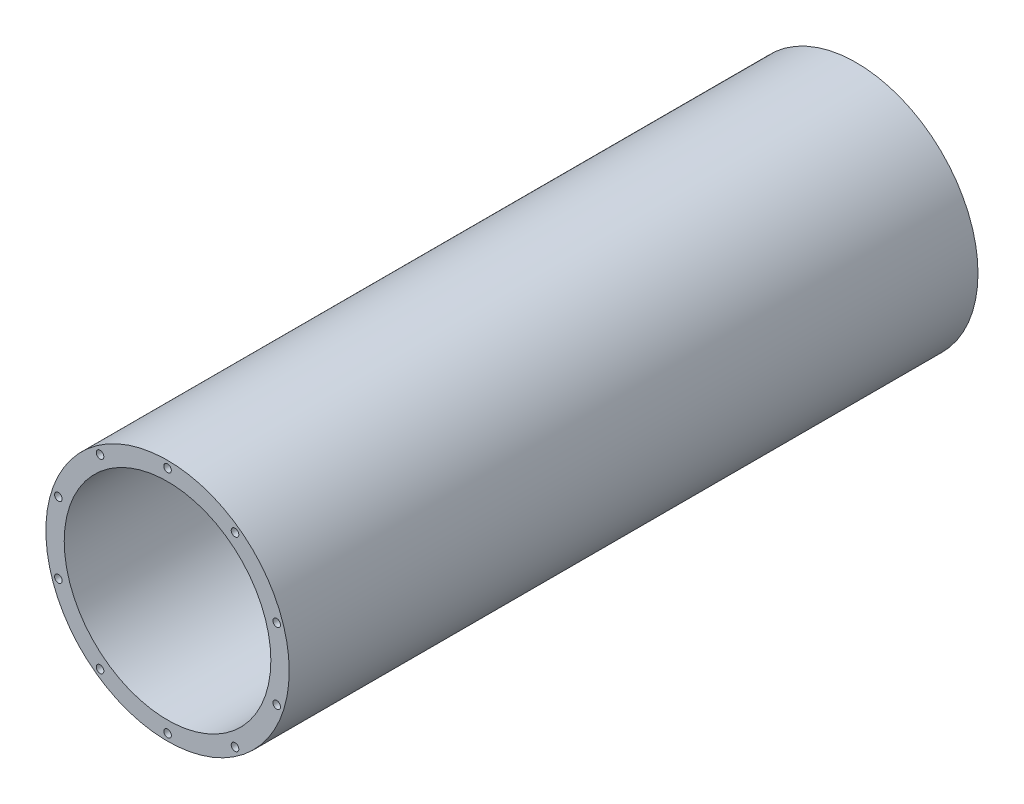
ISO-10303-21;
HEADER;
FILE_DESCRIPTION(('STEP AP214'),'2;1');
FILE_NAME('part.step','',(''),(''),'','','');
FILE_SCHEMA(('AUTOMOTIVE_DESIGN { 1 0 10303 214 1 1 1 1 }'));
ENDSEC;
DATA;
#1=APPLICATION_CONTEXT('core data for automotive mechanical design processes');
#2=APPLICATION_PROTOCOL_DEFINITION('international standard','automotive_design',2000,#1);
#3=PRODUCT_CONTEXT('',#1,'mechanical');
#4=PRODUCT('Part','Part','',(#3));
#5=PRODUCT_RELATED_PRODUCT_CATEGORY('part','',(#4));
#6=PRODUCT_DEFINITION_FORMATION('','',#4);
#7=PRODUCT_DEFINITION_CONTEXT('part definition',#1,'design');
#8=PRODUCT_DEFINITION('design','',#6,#7);
#9=PRODUCT_DEFINITION_SHAPE('','',#8);
#10=(LENGTH_UNIT() NAMED_UNIT(*) SI_UNIT(.MILLI.,.METRE.));
#11=(NAMED_UNIT(*) PLANE_ANGLE_UNIT() SI_UNIT($,.RADIAN.));
#12=(NAMED_UNIT(*) SI_UNIT($,.STERADIAN.) SOLID_ANGLE_UNIT());
#13=UNCERTAINTY_MEASURE_WITH_UNIT(LENGTH_MEASURE(1.E-05),#10,'distance_accuracy_value','');
#14=(GEOMETRIC_REPRESENTATION_CONTEXT(3) GLOBAL_UNCERTAINTY_ASSIGNED_CONTEXT((#13)) GLOBAL_UNIT_ASSIGNED_CONTEXT((#10,
#11,#12)) REPRESENTATION_CONTEXT('',''));
#15=CARTESIAN_POINT('',(0.,0.,0.));
#16=DIRECTION('',(0.,0.,1.));
#17=DIRECTION('',(1.,0.,0.));
#18=AXIS2_PLACEMENT_3D('',#15,#16,#17);
#19=CARTESIAN_POINT('',(0.,0.,300.));
#20=DIRECTION('',(0.,0.,-1.));
#21=DIRECTION('',(-1.,0.,0.));
#22=AXIS2_PLACEMENT_3D('',#19,#20,#21);
#23=CYLINDRICAL_SURFACE('',#22,53.);
#24=CARTESIAN_POINT('',(0.,0.,300.));
#25=DIRECTION('',(0.,0.,1.));
#26=DIRECTION('',(1.,0.,0.));
#27=AXIS2_PLACEMENT_3D('',#24,#25,#26);
#28=CIRCLE('',#27,53.);
#29=CARTESIAN_POINT('',(53.,0.,300.));
#30=VERTEX_POINT('',#29);
#31=EDGE_CURVE('E11',#30,#30,#28,.T.);
#32=ORIENTED_EDGE('',*,*,#31,.F.);
#33=EDGE_LOOP('',(#32));
#34=FACE_BOUND('',#33,.T.);
#35=CARTESIAN_POINT('',(0.,0.,0.));
#36=DIRECTION('',(0.,0.,1.));
#37=DIRECTION('',(1.,0.,0.));
#38=AXIS2_PLACEMENT_3D('',#35,#36,#37);
#39=CIRCLE('',#38,53.);
#40=CARTESIAN_POINT('',(53.,0.,0.));
#41=VERTEX_POINT('',#40);
#42=EDGE_CURVE('E42',#41,#41,#39,.T.);
#43=ORIENTED_EDGE('',*,*,#42,.T.);
#44=EDGE_LOOP('',(#43));
#45=FACE_BOUND('',#44,.T.);
#46=ADVANCED_FACE('F39',(#34,#45),#23,.T.);
#47=CARTESIAN_POINT('',(0.,0.,300.));
#48=DIRECTION('',(0.,0.,1.));
#49=DIRECTION('',(1.,0.,0.));
#50=AXIS2_PLACEMENT_3D('',#47,#48,#49);
#51=PLANE('',#50);
#52=CARTESIAN_POINT('',(-29.3892626146231,40.4508497187478,300.));
#53=DIRECTION('',(0.,0.,1.));
#54=DIRECTION('',(1.,0.,0.));
#55=AXIS2_PLACEMENT_3D('',#52,#53,#54);
#56=CIRCLE('',#55,1.64999999999999);
#57=CARTESIAN_POINT('',(-27.7392626146231,40.4508497187478,300.));
#58=VERTEX_POINT('',#57);
#59=EDGE_CURVE('E118',#58,#58,#56,.T.);
#60=ORIENTED_EDGE('',*,*,#59,.F.);
#61=EDGE_LOOP('',(#60));
#62=FACE_BOUND('',#61,.T.);
#63=CARTESIAN_POINT('',(-47.5528258147575,15.4508497187479,300.));
#64=DIRECTION('',(0.,0.,1.));
#65=DIRECTION('',(1.,0.,0.));
#66=AXIS2_PLACEMENT_3D('',#63,#64,#65);
#67=CIRCLE('',#66,1.64999999999999);
#68=CARTESIAN_POINT('',(-45.9028258147575,15.4508497187479,300.));
#69=VERTEX_POINT('',#68);
#70=EDGE_CURVE('E117',#69,#69,#67,.T.);
#71=ORIENTED_EDGE('',*,*,#70,.F.);
#72=EDGE_LOOP('',(#71));
#73=FACE_BOUND('',#72,.T.);
#74=CARTESIAN_POINT('',(-47.5528258147578,-15.4508497187469,300.));
#75=DIRECTION('',(0.,0.,1.));
#76=DIRECTION('',(1.,0.,0.));
#77=AXIS2_PLACEMENT_3D('',#74,#75,#76);
#78=CIRCLE('',#77,1.64999999999999);
#79=CARTESIAN_POINT('',(-45.9028258147578,-15.4508497187469,300.));
#80=VERTEX_POINT('',#79);
#81=EDGE_CURVE('E128',#80,#80,#78,.T.);
#82=ORIENTED_EDGE('',*,*,#81,.F.);
#83=EDGE_LOOP('',(#82));
#84=FACE_BOUND('',#83,.T.);
#85=CARTESIAN_POINT('',(-29.389262614624,-40.4508497187471,300.));
#86=DIRECTION('',(0.,0.,1.));
#87=DIRECTION('',(1.,0.,0.));
#88=AXIS2_PLACEMENT_3D('',#85,#86,#87);
#89=CIRCLE('',#88,1.64999999999999);
#90=CARTESIAN_POINT('',(-27.739262614624,-40.4508497187471,300.));
#91=VERTEX_POINT('',#90);
#92=EDGE_CURVE('E134',#91,#91,#89,.T.);
#93=ORIENTED_EDGE('',*,*,#92,.F.);
#94=EDGE_LOOP('',(#93));
#95=FACE_BOUND('',#94,.T.);
#96=CARTESIAN_POINT('',(0.,-50.,300.));
#97=DIRECTION('',(0.,0.,1.));
#98=DIRECTION('',(1.,0.,0.));
#99=AXIS2_PLACEMENT_3D('',#96,#97,#98);
#100=CIRCLE('',#99,1.64999999999999);
#101=CARTESIAN_POINT('',(1.64999999999999,-50.,300.));
#102=VERTEX_POINT('',#101);
#103=EDGE_CURVE('E140',#102,#102,#100,.T.);
#104=ORIENTED_EDGE('',*,*,#103,.F.);
#105=EDGE_LOOP('',(#104));
#106=FACE_BOUND('',#105,.T.);
#107=CARTESIAN_POINT('',(29.3892626146234,-40.4508497187475,300.));
#108=DIRECTION('',(0.,0.,1.));
#109=DIRECTION('',(1.,0.,0.));
#110=AXIS2_PLACEMENT_3D('',#107,#108,#109);
#111=CIRCLE('',#110,1.64999999999999);
#112=CARTESIAN_POINT('',(31.0392626146234,-40.4508497187475,300.));
#113=VERTEX_POINT('',#112);
#114=EDGE_CURVE('E146',#113,#113,#111,.T.);
#115=ORIENTED_EDGE('',*,*,#114,.F.);
#116=EDGE_LOOP('',(#115));
#117=FACE_BOUND('',#116,.T.);
#118=CARTESIAN_POINT('',(47.5528258147576,-15.4508497187476,300.));
#119=DIRECTION('',(0.,0.,1.));
#120=DIRECTION('',(1.,0.,0.));
#121=AXIS2_PLACEMENT_3D('',#118,#119,#120);
#122=CIRCLE('',#121,1.64999999999999);
#123=CARTESIAN_POINT('',(49.2028258147576,-15.4508497187476,300.));
#124=VERTEX_POINT('',#123);
#125=EDGE_CURVE('E152',#124,#124,#122,.T.);
#126=ORIENTED_EDGE('',*,*,#125,.F.);
#127=EDGE_LOOP('',(#126));
#128=FACE_BOUND('',#127,.T.);
#129=CARTESIAN_POINT('',(47.5528258147577,15.4508497187472,300.));
#130=DIRECTION('',(0.,0.,1.));
#131=DIRECTION('',(1.,0.,0.));
#132=AXIS2_PLACEMENT_3D('',#129,#130,#131);
#133=CIRCLE('',#132,1.64999999999999);
#134=CARTESIAN_POINT('',(49.2028258147577,15.4508497187472,300.));
#135=VERTEX_POINT('',#134);
#136=EDGE_CURVE('E158',#135,#135,#133,.T.);
#137=ORIENTED_EDGE('',*,*,#136,.F.);
#138=EDGE_LOOP('',(#137));
#139=FACE_BOUND('',#138,.T.);
#140=CARTESIAN_POINT('',(29.3892626146237,40.4508497187473,300.));
#141=DIRECTION('',(0.,0.,1.));
#142=DIRECTION('',(1.,0.,0.));
#143=AXIS2_PLACEMENT_3D('',#140,#141,#142);
#144=CIRCLE('',#143,1.64999999999999);
#145=CARTESIAN_POINT('',(31.0392626146237,40.4508497187473,300.));
#146=VERTEX_POINT('',#145);
#147=EDGE_CURVE('E164',#146,#146,#144,.T.);
#148=ORIENTED_EDGE('',*,*,#147,.F.);
#149=EDGE_LOOP('',(#148));
#150=FACE_BOUND('',#149,.T.);
#151=CARTESIAN_POINT('',(0.,50.,300.));
#152=DIRECTION('',(0.,0.,1.));
#153=DIRECTION('',(1.,0.,0.));
#154=AXIS2_PLACEMENT_3D('',#151,#152,#153);
#155=CIRCLE('',#154,1.64999999999999);
#156=CARTESIAN_POINT('',(1.64999999999999,50.,300.));
#157=VERTEX_POINT('',#156);
#158=EDGE_CURVE('E170',#157,#157,#155,.T.);
#159=ORIENTED_EDGE('',*,*,#158,.F.);
#160=EDGE_LOOP('',(#159));
#161=FACE_BOUND('',#160,.T.);
#162=CARTESIAN_POINT('',(0.,0.,300.));
#163=DIRECTION('',(0.,0.,-1.));
#164=DIRECTION('',(-1.,0.,0.));
#165=AXIS2_PLACEMENT_3D('',#162,#163,#164);
#166=CIRCLE('',#165,45.);
#167=CARTESIAN_POINT('',(-45.,0.,300.));
#168=VERTEX_POINT('',#167);
#169=EDGE_CURVE('E237',#168,#168,#166,.T.);
#170=ORIENTED_EDGE('',*,*,#169,.T.);
#171=EDGE_LOOP('',(#170));
#172=FACE_BOUND('',#171,.T.);
#173=ORIENTED_EDGE('',*,*,#31,.T.);
#174=EDGE_LOOP('',(#173));
#175=FACE_BOUND('',#174,.T.);
#176=ADVANCED_FACE('F248',(#62,#73,#84,#95,#106,#117,#128,#139,#150,#161,#172,#175),#51,.T.);
#177=CARTESIAN_POINT('',(0.,0.,0.));
#178=DIRECTION('',(0.,0.,1.));
#179=DIRECTION('',(1.,0.,0.));
#180=AXIS2_PLACEMENT_3D('',#177,#178,#179);
#181=PLANE('',#180);
#182=CARTESIAN_POINT('',(-29.3892626146231,40.4508497187478,0.));
#183=DIRECTION('',(0.,0.,-1.));
#184=DIRECTION('',(-1.,0.,0.));
#185=AXIS2_PLACEMENT_3D('',#182,#183,#184);
#186=CIRCLE('',#185,1.64999999999999);
#187=CARTESIAN_POINT('',(-31.0392626146231,40.4508497187478,0.));
#188=VERTEX_POINT('',#187);
#189=EDGE_CURVE('E176',#188,#188,#186,.T.);
#190=ORIENTED_EDGE('',*,*,#189,.F.);
#191=EDGE_LOOP('',(#190));
#192=FACE_BOUND('',#191,.T.);
#193=CARTESIAN_POINT('',(-47.5528258147575,15.4508497187479,0.));
#194=DIRECTION('',(0.,0.,-1.));
#195=DIRECTION('',(-1.,0.,0.));
#196=AXIS2_PLACEMENT_3D('',#193,#194,#195);
#197=CIRCLE('',#196,1.64999999999999);
#198=CARTESIAN_POINT('',(-49.2028258147575,15.4508497187479,0.));
#199=VERTEX_POINT('',#198);
#200=EDGE_CURVE('E182',#199,#199,#197,.T.);
#201=ORIENTED_EDGE('',*,*,#200,.F.);
#202=EDGE_LOOP('',(#201));
#203=FACE_BOUND('',#202,.T.);
#204=CARTESIAN_POINT('',(-47.5528258147578,-15.4508497187469,0.));
#205=DIRECTION('',(0.,0.,-1.));
#206=DIRECTION('',(-1.,0.,0.));
#207=AXIS2_PLACEMENT_3D('',#204,#205,#206);
#208=CIRCLE('',#207,1.64999999999999);
#209=CARTESIAN_POINT('',(-49.2028258147578,-15.4508497187469,0.));
#210=VERTEX_POINT('',#209);
#211=EDGE_CURVE('E188',#210,#210,#208,.T.);
#212=ORIENTED_EDGE('',*,*,#211,.F.);
#213=EDGE_LOOP('',(#212));
#214=FACE_BOUND('',#213,.T.);
#215=CARTESIAN_POINT('',(-29.389262614624,-40.4508497187471,0.));
#216=DIRECTION('',(0.,0.,-1.));
#217=DIRECTION('',(-1.,0.,0.));
#218=AXIS2_PLACEMENT_3D('',#215,#216,#217);
#219=CIRCLE('',#218,1.64999999999999);
#220=CARTESIAN_POINT('',(-31.039262614624,-40.4508497187471,0.));
#221=VERTEX_POINT('',#220);
#222=EDGE_CURVE('E194',#221,#221,#219,.T.);
#223=ORIENTED_EDGE('',*,*,#222,.F.);
#224=EDGE_LOOP('',(#223));
#225=FACE_BOUND('',#224,.T.);
#226=CARTESIAN_POINT('',(0.,-50.,0.));
#227=DIRECTION('',(0.,0.,-1.));
#228=DIRECTION('',(-1.,0.,0.));
#229=AXIS2_PLACEMENT_3D('',#226,#227,#228);
#230=CIRCLE('',#229,1.64999999999999);
#231=CARTESIAN_POINT('',(-1.64999999999999,-50.,0.));
#232=VERTEX_POINT('',#231);
#233=EDGE_CURVE('E200',#232,#232,#230,.T.);
#234=ORIENTED_EDGE('',*,*,#233,.F.);
#235=EDGE_LOOP('',(#234));
#236=FACE_BOUND('',#235,.T.);
#237=CARTESIAN_POINT('',(29.3892626146234,-40.4508497187475,0.));
#238=DIRECTION('',(0.,0.,-1.));
#239=DIRECTION('',(-1.,0.,0.));
#240=AXIS2_PLACEMENT_3D('',#237,#238,#239);
#241=CIRCLE('',#240,1.64999999999999);
#242=CARTESIAN_POINT('',(27.7392626146234,-40.4508497187475,0.));
#243=VERTEX_POINT('',#242);
#244=EDGE_CURVE('E206',#243,#243,#241,.T.);
#245=ORIENTED_EDGE('',*,*,#244,.F.);
#246=EDGE_LOOP('',(#245));
#247=FACE_BOUND('',#246,.T.);
#248=CARTESIAN_POINT('',(47.5528258147576,-15.4508497187476,0.));
#249=DIRECTION('',(0.,0.,-1.));
#250=DIRECTION('',(-1.,0.,0.));
#251=AXIS2_PLACEMENT_3D('',#248,#249,#250);
#252=CIRCLE('',#251,1.64999999999999);
#253=CARTESIAN_POINT('',(45.9028258147576,-15.4508497187476,0.));
#254=VERTEX_POINT('',#253);
#255=EDGE_CURVE('E212',#254,#254,#252,.T.);
#256=ORIENTED_EDGE('',*,*,#255,.F.);
#257=EDGE_LOOP('',(#256));
#258=FACE_BOUND('',#257,.T.);
#259=CARTESIAN_POINT('',(47.5528258147577,15.4508497187472,0.));
#260=DIRECTION('',(0.,0.,-1.));
#261=DIRECTION('',(-1.,0.,0.));
#262=AXIS2_PLACEMENT_3D('',#259,#260,#261);
#263=CIRCLE('',#262,1.64999999999999);
#264=CARTESIAN_POINT('',(45.9028258147577,15.4508497187472,0.));
#265=VERTEX_POINT('',#264);
#266=EDGE_CURVE('E218',#265,#265,#263,.T.);
#267=ORIENTED_EDGE('',*,*,#266,.F.);
#268=EDGE_LOOP('',(#267));
#269=FACE_BOUND('',#268,.T.);
#270=CARTESIAN_POINT('',(29.3892626146237,40.4508497187473,0.));
#271=DIRECTION('',(0.,0.,-1.));
#272=DIRECTION('',(-1.,0.,0.));
#273=AXIS2_PLACEMENT_3D('',#270,#271,#272);
#274=CIRCLE('',#273,1.64999999999999);
#275=CARTESIAN_POINT('',(27.7392626146237,40.4508497187473,0.));
#276=VERTEX_POINT('',#275);
#277=EDGE_CURVE('E224',#276,#276,#274,.T.);
#278=ORIENTED_EDGE('',*,*,#277,.F.);
#279=EDGE_LOOP('',(#278));
#280=FACE_BOUND('',#279,.T.);
#281=CARTESIAN_POINT('',(0.,50.,0.));
#282=DIRECTION('',(0.,0.,-1.));
#283=DIRECTION('',(-1.,0.,0.));
#284=AXIS2_PLACEMENT_3D('',#281,#282,#283);
#285=CIRCLE('',#284,1.64999999999999);
#286=CARTESIAN_POINT('',(-1.64999999999999,50.,0.));
#287=VERTEX_POINT('',#286);
#288=EDGE_CURVE('E230',#287,#287,#285,.T.);
#289=ORIENTED_EDGE('',*,*,#288,.F.);
#290=EDGE_LOOP('',(#289));
#291=FACE_BOUND('',#290,.T.);
#292=CARTESIAN_POINT('',(0.,0.,0.));
#293=DIRECTION('',(0.,0.,-1.));
#294=DIRECTION('',(-1.,0.,0.));
#295=AXIS2_PLACEMENT_3D('',#292,#293,#294);
#296=CIRCLE('',#295,45.);
#297=CARTESIAN_POINT('',(-45.,0.,0.));
#298=VERTEX_POINT('',#297);
#299=EDGE_CURVE('E236',#298,#298,#296,.T.);
#300=ORIENTED_EDGE('',*,*,#299,.F.);
#301=EDGE_LOOP('',(#300));
#302=FACE_BOUND('',#301,.T.);
#303=ORIENTED_EDGE('',*,*,#42,.F.);
#304=EDGE_LOOP('',(#303));
#305=FACE_BOUND('',#304,.T.);
#306=ADVANCED_FACE('F245',(#192,#203,#214,#225,#236,#247,#258,#269,#280,#291,#302,#305),#181,.F.);
#307=CARTESIAN_POINT('',(0.,0.,300.));
#308=DIRECTION('',(0.,0.,-1.));
#309=DIRECTION('',(-1.,0.,0.));
#310=AXIS2_PLACEMENT_3D('',#307,#308,#309);
#311=CYLINDRICAL_SURFACE('',#310,45.);
#312=ORIENTED_EDGE('',*,*,#169,.F.);
#313=EDGE_LOOP('',(#312));
#314=FACE_BOUND('',#313,.T.);
#315=ORIENTED_EDGE('',*,*,#299,.T.);
#316=EDGE_LOOP('',(#315));
#317=FACE_BOUND('',#316,.T.);
#318=ADVANCED_FACE('F243',(#314,#317),#311,.F.);
#319=CARTESIAN_POINT('',(0.,50.,10.1));
#320=DIRECTION('',(0.,0.,-1.));
#321=DIRECTION('',(-1.,0.,0.));
#322=AXIS2_PLACEMENT_3D('',#319,#320,#321);
#323=CONICAL_SURFACE('',#322,1.64999999999999,1.02974425867665);
#324=CARTESIAN_POINT('',(0.,50.,11.0914200213955));
#325=VERTEX_POINT('',#324);
#326=VERTEX_LOOP('',#325);
#327=FACE_BOUND('',#326,.T.);
#328=CARTESIAN_POINT('',(0.,50.,10.1));
#329=DIRECTION('',(0.,0.,-1.));
#330=DIRECTION('',(-1.,0.,0.));
#331=AXIS2_PLACEMENT_3D('',#328,#329,#330);
#332=CIRCLE('',#331,1.64999999999999);
#333=CARTESIAN_POINT('',(-1.64999999999999,50.,10.1));
#334=VERTEX_POINT('',#333);
#335=EDGE_CURVE('E233',#334,#334,#332,.T.);
#336=ORIENTED_EDGE('',*,*,#335,.T.);
#337=EDGE_LOOP('',(#336));
#338=FACE_BOUND('',#337,.T.);
#339=ADVANCED_FACE('F269',(#327,#338),#323,.F.);
#340=CARTESIAN_POINT('',(0.,50.,0.));
#341=DIRECTION('',(0.,0.,-1.));
#342=DIRECTION('',(-1.,0.,0.));
#343=AXIS2_PLACEMENT_3D('',#340,#341,#342);
#344=CYLINDRICAL_SURFACE('',#343,1.64999999999999);
#345=ORIENTED_EDGE('',*,*,#335,.F.);
#346=EDGE_LOOP('',(#345));
#347=FACE_BOUND('',#346,.T.);
#348=ORIENTED_EDGE('',*,*,#288,.T.);
#349=EDGE_LOOP('',(#348));
#350=FACE_BOUND('',#349,.T.);
#351=ADVANCED_FACE('F273',(#347,#350),#344,.F.);
#352=CARTESIAN_POINT('',(29.3892626146237,40.4508497187473,10.1));
#353=DIRECTION('',(0.,0.,-1.));
#354=DIRECTION('',(-1.,0.,0.));
#355=AXIS2_PLACEMENT_3D('',#352,#353,#354);
#356=CONICAL_SURFACE('',#355,1.64999999999999,1.02974425867665);
#357=CARTESIAN_POINT('',(29.3892626146237,40.4508497187473,11.0914200213955));
#358=VERTEX_POINT('',#357);
#359=VERTEX_LOOP('',#358);
#360=FACE_BOUND('',#359,.T.);
#361=CARTESIAN_POINT('',(29.3892626146237,40.4508497187473,10.1));
#362=DIRECTION('',(0.,0.,-1.));
#363=DIRECTION('',(-1.,0.,0.));
#364=AXIS2_PLACEMENT_3D('',#361,#362,#363);
#365=CIRCLE('',#364,1.64999999999999);
#366=CARTESIAN_POINT('',(27.7392626146237,40.4508497187473,10.1));
#367=VERTEX_POINT('',#366);
#368=EDGE_CURVE('E227',#367,#367,#365,.T.);
#369=ORIENTED_EDGE('',*,*,#368,.T.);
#370=EDGE_LOOP('',(#369));
#371=FACE_BOUND('',#370,.T.);
#372=ADVANCED_FACE('F276',(#360,#371),#356,.F.);
#373=CARTESIAN_POINT('',(29.3892626146237,40.4508497187473,0.));
#374=DIRECTION('',(0.,0.,-1.));
#375=DIRECTION('',(-1.,0.,0.));
#376=AXIS2_PLACEMENT_3D('',#373,#374,#375);
#377=CYLINDRICAL_SURFACE('',#376,1.64999999999999);
#378=ORIENTED_EDGE('',*,*,#368,.F.);
#379=EDGE_LOOP('',(#378));
#380=FACE_BOUND('',#379,.T.);
#381=ORIENTED_EDGE('',*,*,#277,.T.);
#382=EDGE_LOOP('',(#381));
#383=FACE_BOUND('',#382,.T.);
#384=ADVANCED_FACE('F280',(#380,#383),#377,.F.);
#385=CARTESIAN_POINT('',(47.5528258147577,15.4508497187472,10.1));
#386=DIRECTION('',(0.,0.,-1.));
#387=DIRECTION('',(-1.,0.,0.));
#388=AXIS2_PLACEMENT_3D('',#385,#386,#387);
#389=CONICAL_SURFACE('',#388,1.64999999999999,1.02974425867665);
#390=CARTESIAN_POINT('',(47.5528258147577,15.4508497187472,11.0914200213955));
#391=VERTEX_POINT('',#390);
#392=VERTEX_LOOP('',#391);
#393=FACE_BOUND('',#392,.T.);
#394=CARTESIAN_POINT('',(47.5528258147577,15.4508497187472,10.1));
#395=DIRECTION('',(0.,0.,-1.));
#396=DIRECTION('',(-1.,0.,0.));
#397=AXIS2_PLACEMENT_3D('',#394,#395,#396);
#398=CIRCLE('',#397,1.64999999999999);
#399=CARTESIAN_POINT('',(45.9028258147577,15.4508497187472,10.1));
#400=VERTEX_POINT('',#399);
#401=EDGE_CURVE('E221',#400,#400,#398,.T.);
#402=ORIENTED_EDGE('',*,*,#401,.T.);
#403=EDGE_LOOP('',(#402));
#404=FACE_BOUND('',#403,.T.);
#405=ADVANCED_FACE('F283',(#393,#404),#389,.F.);
#406=CARTESIAN_POINT('',(47.5528258147577,15.4508497187472,0.));
#407=DIRECTION('',(0.,0.,-1.));
#408=DIRECTION('',(-1.,0.,0.));
#409=AXIS2_PLACEMENT_3D('',#406,#407,#408);
#410=CYLINDRICAL_SURFACE('',#409,1.64999999999999);
#411=ORIENTED_EDGE('',*,*,#401,.F.);
#412=EDGE_LOOP('',(#411));
#413=FACE_BOUND('',#412,.T.);
#414=ORIENTED_EDGE('',*,*,#266,.T.);
#415=EDGE_LOOP('',(#414));
#416=FACE_BOUND('',#415,.T.);
#417=ADVANCED_FACE('F287',(#413,#416),#410,.F.);
#418=CARTESIAN_POINT('',(47.5528258147576,-15.4508497187476,10.1));
#419=DIRECTION('',(0.,0.,-1.));
#420=DIRECTION('',(-1.,0.,0.));
#421=AXIS2_PLACEMENT_3D('',#418,#419,#420);
#422=CONICAL_SURFACE('',#421,1.64999999999999,1.02974425867665);
#423=CARTESIAN_POINT('',(47.5528258147576,-15.4508497187476,11.0914200213955));
#424=VERTEX_POINT('',#423);
#425=VERTEX_LOOP('',#424);
#426=FACE_BOUND('',#425,.T.);
#427=CARTESIAN_POINT('',(47.5528258147576,-15.4508497187476,10.1));
#428=DIRECTION('',(0.,0.,-1.));
#429=DIRECTION('',(-1.,0.,0.));
#430=AXIS2_PLACEMENT_3D('',#427,#428,#429);
#431=CIRCLE('',#430,1.64999999999999);
#432=CARTESIAN_POINT('',(45.9028258147576,-15.4508497187476,10.1));
#433=VERTEX_POINT('',#432);
#434=EDGE_CURVE('E215',#433,#433,#431,.T.);
#435=ORIENTED_EDGE('',*,*,#434,.T.);
#436=EDGE_LOOP('',(#435));
#437=FACE_BOUND('',#436,.T.);
#438=ADVANCED_FACE('F291',(#426,#437),#422,.F.);
#439=CARTESIAN_POINT('',(47.5528258147576,-15.4508497187476,0.));
#440=DIRECTION('',(0.,0.,-1.));
#441=DIRECTION('',(-1.,0.,0.));
#442=AXIS2_PLACEMENT_3D('',#439,#440,#441);
#443=CYLINDRICAL_SURFACE('',#442,1.64999999999999);
#444=ORIENTED_EDGE('',*,*,#434,.F.);
#445=EDGE_LOOP('',(#444));
#446=FACE_BOUND('',#445,.T.);
#447=ORIENTED_EDGE('',*,*,#255,.T.);
#448=EDGE_LOOP('',(#447));
#449=FACE_BOUND('',#448,.T.);
#450=ADVANCED_FACE('F295',(#446,#449),#443,.F.);
#451=CARTESIAN_POINT('',(29.3892626146234,-40.4508497187475,10.1));
#452=DIRECTION('',(0.,0.,-1.));
#453=DIRECTION('',(-1.,0.,0.));
#454=AXIS2_PLACEMENT_3D('',#451,#452,#453);
#455=CONICAL_SURFACE('',#454,1.64999999999999,1.02974425867665);
#456=CARTESIAN_POINT('',(29.3892626146234,-40.4508497187475,11.0914200213955));
#457=VERTEX_POINT('',#456);
#458=VERTEX_LOOP('',#457);
#459=FACE_BOUND('',#458,.T.);
#460=CARTESIAN_POINT('',(29.3892626146234,-40.4508497187475,10.1));
#461=DIRECTION('',(0.,0.,-1.));
#462=DIRECTION('',(-1.,0.,0.));
#463=AXIS2_PLACEMENT_3D('',#460,#461,#462);
#464=CIRCLE('',#463,1.64999999999999);
#465=CARTESIAN_POINT('',(27.7392626146234,-40.4508497187475,10.1));
#466=VERTEX_POINT('',#465);
#467=EDGE_CURVE('E209',#466,#466,#464,.T.);
#468=ORIENTED_EDGE('',*,*,#467,.T.);
#469=EDGE_LOOP('',(#468));
#470=FACE_BOUND('',#469,.T.);
#471=ADVANCED_FACE('F299',(#459,#470),#455,.F.);
#472=CARTESIAN_POINT('',(29.3892626146234,-40.4508497187475,0.));
#473=DIRECTION('',(0.,0.,-1.));
#474=DIRECTION('',(-1.,0.,0.));
#475=AXIS2_PLACEMENT_3D('',#472,#473,#474);
#476=CYLINDRICAL_SURFACE('',#475,1.64999999999999);
#477=ORIENTED_EDGE('',*,*,#467,.F.);
#478=EDGE_LOOP('',(#477));
#479=FACE_BOUND('',#478,.T.);
#480=ORIENTED_EDGE('',*,*,#244,.T.);
#481=EDGE_LOOP('',(#480));
#482=FACE_BOUND('',#481,.T.);
#483=ADVANCED_FACE('F303',(#479,#482),#476,.F.);
#484=CARTESIAN_POINT('',(0.,-50.,10.1));
#485=DIRECTION('',(0.,0.,-1.));
#486=DIRECTION('',(-1.,0.,0.));
#487=AXIS2_PLACEMENT_3D('',#484,#485,#486);
#488=CONICAL_SURFACE('',#487,1.64999999999999,1.02974425867665);
#489=CARTESIAN_POINT('',(0.,-50.,11.0914200213955));
#490=VERTEX_POINT('',#489);
#491=VERTEX_LOOP('',#490);
#492=FACE_BOUND('',#491,.T.);
#493=CARTESIAN_POINT('',(0.,-50.,10.1));
#494=DIRECTION('',(0.,0.,-1.));
#495=DIRECTION('',(-1.,0.,0.));
#496=AXIS2_PLACEMENT_3D('',#493,#494,#495);
#497=CIRCLE('',#496,1.64999999999999);
#498=CARTESIAN_POINT('',(-1.64999999999999,-50.,10.1));
#499=VERTEX_POINT('',#498);
#500=EDGE_CURVE('E203',#499,#499,#497,.T.);
#501=ORIENTED_EDGE('',*,*,#500,.T.);
#502=EDGE_LOOP('',(#501));
#503=FACE_BOUND('',#502,.T.);
#504=ADVANCED_FACE('F307',(#492,#503),#488,.F.);
#505=CARTESIAN_POINT('',(0.,-50.,0.));
#506=DIRECTION('',(0.,0.,-1.));
#507=DIRECTION('',(-1.,0.,0.));
#508=AXIS2_PLACEMENT_3D('',#505,#506,#507);
#509=CYLINDRICAL_SURFACE('',#508,1.64999999999999);
#510=ORIENTED_EDGE('',*,*,#500,.F.);
#511=EDGE_LOOP('',(#510));
#512=FACE_BOUND('',#511,.T.);
#513=ORIENTED_EDGE('',*,*,#233,.T.);
#514=EDGE_LOOP('',(#513));
#515=FACE_BOUND('',#514,.T.);
#516=ADVANCED_FACE('F311',(#512,#515),#509,.F.);
#517=CARTESIAN_POINT('',(-29.389262614624,-40.4508497187471,10.1));
#518=DIRECTION('',(0.,0.,-1.));
#519=DIRECTION('',(-1.,0.,0.));
#520=AXIS2_PLACEMENT_3D('',#517,#518,#519);
#521=CONICAL_SURFACE('',#520,1.64999999999999,1.02974425867665);
#522=CARTESIAN_POINT('',(-29.389262614624,-40.4508497187471,11.0914200213955));
#523=VERTEX_POINT('',#522);
#524=VERTEX_LOOP('',#523);
#525=FACE_BOUND('',#524,.T.);
#526=CARTESIAN_POINT('',(-29.389262614624,-40.4508497187471,10.1));
#527=DIRECTION('',(0.,0.,-1.));
#528=DIRECTION('',(-1.,0.,0.));
#529=AXIS2_PLACEMENT_3D('',#526,#527,#528);
#530=CIRCLE('',#529,1.64999999999999);
#531=CARTESIAN_POINT('',(-31.039262614624,-40.4508497187471,10.1));
#532=VERTEX_POINT('',#531);
#533=EDGE_CURVE('E197',#532,#532,#530,.T.);
#534=ORIENTED_EDGE('',*,*,#533,.T.);
#535=EDGE_LOOP('',(#534));
#536=FACE_BOUND('',#535,.T.);
#537=ADVANCED_FACE('F315',(#525,#536),#521,.F.);
#538=CARTESIAN_POINT('',(-29.389262614624,-40.4508497187471,0.));
#539=DIRECTION('',(0.,0.,-1.));
#540=DIRECTION('',(-1.,0.,0.));
#541=AXIS2_PLACEMENT_3D('',#538,#539,#540);
#542=CYLINDRICAL_SURFACE('',#541,1.64999999999999);
#543=ORIENTED_EDGE('',*,*,#533,.F.);
#544=EDGE_LOOP('',(#543));
#545=FACE_BOUND('',#544,.T.);
#546=ORIENTED_EDGE('',*,*,#222,.T.);
#547=EDGE_LOOP('',(#546));
#548=FACE_BOUND('',#547,.T.);
#549=ADVANCED_FACE('F319',(#545,#548),#542,.F.);
#550=CARTESIAN_POINT('',(-47.5528258147578,-15.4508497187469,10.1));
#551=DIRECTION('',(0.,0.,-1.));
#552=DIRECTION('',(-1.,0.,0.));
#553=AXIS2_PLACEMENT_3D('',#550,#551,#552);
#554=CONICAL_SURFACE('',#553,1.64999999999999,1.02974425867665);
#555=CARTESIAN_POINT('',(-47.5528258147578,-15.4508497187469,11.0914200213955));
#556=VERTEX_POINT('',#555);
#557=VERTEX_LOOP('',#556);
#558=FACE_BOUND('',#557,.T.);
#559=CARTESIAN_POINT('',(-47.5528258147578,-15.4508497187469,10.1));
#560=DIRECTION('',(0.,0.,-1.));
#561=DIRECTION('',(-1.,0.,0.));
#562=AXIS2_PLACEMENT_3D('',#559,#560,#561);
#563=CIRCLE('',#562,1.64999999999999);
#564=CARTESIAN_POINT('',(-49.2028258147578,-15.4508497187469,10.1));
#565=VERTEX_POINT('',#564);
#566=EDGE_CURVE('E191',#565,#565,#563,.T.);
#567=ORIENTED_EDGE('',*,*,#566,.T.);
#568=EDGE_LOOP('',(#567));
#569=FACE_BOUND('',#568,.T.);
#570=ADVANCED_FACE('F323',(#558,#569),#554,.F.);
#571=CARTESIAN_POINT('',(-47.5528258147578,-15.4508497187469,0.));
#572=DIRECTION('',(0.,0.,-1.));
#573=DIRECTION('',(-1.,0.,0.));
#574=AXIS2_PLACEMENT_3D('',#571,#572,#573);
#575=CYLINDRICAL_SURFACE('',#574,1.64999999999999);
#576=ORIENTED_EDGE('',*,*,#566,.F.);
#577=EDGE_LOOP('',(#576));
#578=FACE_BOUND('',#577,.T.);
#579=ORIENTED_EDGE('',*,*,#211,.T.);
#580=EDGE_LOOP('',(#579));
#581=FACE_BOUND('',#580,.T.);
#582=ADVANCED_FACE('F327',(#578,#581),#575,.F.);
#583=CARTESIAN_POINT('',(-47.5528258147575,15.4508497187479,10.1));
#584=DIRECTION('',(0.,0.,-1.));
#585=DIRECTION('',(-1.,0.,0.));
#586=AXIS2_PLACEMENT_3D('',#583,#584,#585);
#587=CONICAL_SURFACE('',#586,1.64999999999998,1.02974425867665);
#588=CARTESIAN_POINT('',(-47.5528258147575,15.4508497187479,11.0914200213955));
#589=VERTEX_POINT('',#588);
#590=VERTEX_LOOP('',#589);
#591=FACE_BOUND('',#590,.T.);
#592=CARTESIAN_POINT('',(-47.5528258147575,15.4508497187479,10.1));
#593=DIRECTION('',(0.,0.,-1.));
#594=DIRECTION('',(-1.,0.,0.));
#595=AXIS2_PLACEMENT_3D('',#592,#593,#594);
#596=CIRCLE('',#595,1.64999999999998);
#597=CARTESIAN_POINT('',(-49.2028258147575,15.4508497187479,10.1));
#598=VERTEX_POINT('',#597);
#599=EDGE_CURVE('E185',#598,#598,#596,.T.);
#600=ORIENTED_EDGE('',*,*,#599,.T.);
#601=EDGE_LOOP('',(#600));
#602=FACE_BOUND('',#601,.T.);
#603=ADVANCED_FACE('F331',(#591,#602),#587,.F.);
#604=CARTESIAN_POINT('',(-47.5528258147575,15.4508497187479,0.));
#605=DIRECTION('',(0.,0.,-1.));
#606=DIRECTION('',(-1.,0.,0.));
#607=AXIS2_PLACEMENT_3D('',#604,#605,#606);
#608=CYLINDRICAL_SURFACE('',#607,1.64999999999999);
#609=ORIENTED_EDGE('',*,*,#599,.F.);
#610=EDGE_LOOP('',(#609));
#611=FACE_BOUND('',#610,.T.);
#612=ORIENTED_EDGE('',*,*,#200,.T.);
#613=EDGE_LOOP('',(#612));
#614=FACE_BOUND('',#613,.T.);
#615=ADVANCED_FACE('F335',(#611,#614),#608,.F.);
#616=CARTESIAN_POINT('',(-29.3892626146231,40.4508497187478,10.1));
#617=DIRECTION('',(0.,0.,-1.));
#618=DIRECTION('',(-1.,0.,0.));
#619=AXIS2_PLACEMENT_3D('',#616,#617,#618);
#620=CONICAL_SURFACE('',#619,1.64999999999999,1.02974425867665);
#621=CARTESIAN_POINT('',(-29.3892626146231,40.4508497187478,11.0914200213955));
#622=VERTEX_POINT('',#621);
#623=VERTEX_LOOP('',#622);
#624=FACE_BOUND('',#623,.T.);
#625=CARTESIAN_POINT('',(-29.3892626146231,40.4508497187478,10.1));
#626=DIRECTION('',(0.,0.,-1.));
#627=DIRECTION('',(-1.,0.,0.));
#628=AXIS2_PLACEMENT_3D('',#625,#626,#627);
#629=CIRCLE('',#628,1.64999999999999);
#630=CARTESIAN_POINT('',(-31.0392626146231,40.4508497187478,10.1));
#631=VERTEX_POINT('',#630);
#632=EDGE_CURVE('E179',#631,#631,#629,.T.);
#633=ORIENTED_EDGE('',*,*,#632,.T.);
#634=EDGE_LOOP('',(#633));
#635=FACE_BOUND('',#634,.T.);
#636=ADVANCED_FACE('F339',(#624,#635),#620,.F.);
#637=CARTESIAN_POINT('',(-29.3892626146231,40.4508497187478,0.));
#638=DIRECTION('',(0.,0.,-1.));
#639=DIRECTION('',(-1.,0.,0.));
#640=AXIS2_PLACEMENT_3D('',#637,#638,#639);
#641=CYLINDRICAL_SURFACE('',#640,1.64999999999999);
#642=ORIENTED_EDGE('',*,*,#632,.F.);
#643=EDGE_LOOP('',(#642));
#644=FACE_BOUND('',#643,.T.);
#645=ORIENTED_EDGE('',*,*,#189,.T.);
#646=EDGE_LOOP('',(#645));
#647=FACE_BOUND('',#646,.T.);
#648=ADVANCED_FACE('F343',(#644,#647),#641,.F.);
#649=CARTESIAN_POINT('',(0.,50.,289.9));
#650=DIRECTION('',(0.,0.,1.));
#651=DIRECTION('',(1.,0.,0.));
#652=AXIS2_PLACEMENT_3D('',#649,#650,#651);
#653=CONICAL_SURFACE('',#652,1.64999999999999,1.02974425867666);
#654=CARTESIAN_POINT('',(0.,50.,288.908579978605));
#655=VERTEX_POINT('',#654);
#656=VERTEX_LOOP('',#655);
#657=FACE_BOUND('',#656,.T.);
#658=CARTESIAN_POINT('',(0.,50.,289.9));
#659=DIRECTION('',(0.,0.,1.));
#660=DIRECTION('',(1.,0.,0.));
#661=AXIS2_PLACEMENT_3D('',#658,#659,#660);
#662=CIRCLE('',#661,1.64999999999999);
#663=CARTESIAN_POINT('',(1.64999999999999,50.,289.9));
#664=VERTEX_POINT('',#663);
#665=EDGE_CURVE('E173',#664,#664,#662,.T.);
#666=ORIENTED_EDGE('',*,*,#665,.T.);
#667=EDGE_LOOP('',(#666));
#668=FACE_BOUND('',#667,.T.);
#669=ADVANCED_FACE('F347',(#657,#668),#653,.F.);
#670=CARTESIAN_POINT('',(0.,50.,300.));
#671=DIRECTION('',(0.,0.,1.));
#672=DIRECTION('',(1.,0.,0.));
#673=AXIS2_PLACEMENT_3D('',#670,#671,#672);
#674=CYLINDRICAL_SURFACE('',#673,1.64999999999999);
#675=ORIENTED_EDGE('',*,*,#665,.F.);
#676=EDGE_LOOP('',(#675));
#677=FACE_BOUND('',#676,.T.);
#678=ORIENTED_EDGE('',*,*,#158,.T.);
#679=EDGE_LOOP('',(#678));
#680=FACE_BOUND('',#679,.T.);
#681=ADVANCED_FACE('F351',(#677,#680),#674,.F.);
#682=CARTESIAN_POINT('',(29.3892626146237,40.4508497187473,289.9));
#683=DIRECTION('',(0.,0.,1.));
#684=DIRECTION('',(1.,0.,0.));
#685=AXIS2_PLACEMENT_3D('',#682,#683,#684);
#686=CONICAL_SURFACE('',#685,1.64999999999999,1.02974425867666);
#687=CARTESIAN_POINT('',(29.3892626146237,40.4508497187473,288.908579978605));
#688=VERTEX_POINT('',#687);
#689=VERTEX_LOOP('',#688);
#690=FACE_BOUND('',#689,.T.);
#691=CARTESIAN_POINT('',(29.3892626146237,40.4508497187473,289.9));
#692=DIRECTION('',(0.,0.,1.));
#693=DIRECTION('',(1.,0.,0.));
#694=AXIS2_PLACEMENT_3D('',#691,#692,#693);
#695=CIRCLE('',#694,1.64999999999999);
#696=CARTESIAN_POINT('',(31.0392626146237,40.4508497187473,289.9));
#697=VERTEX_POINT('',#696);
#698=EDGE_CURVE('E167',#697,#697,#695,.T.);
#699=ORIENTED_EDGE('',*,*,#698,.T.);
#700=EDGE_LOOP('',(#699));
#701=FACE_BOUND('',#700,.T.);
#702=ADVANCED_FACE('F355',(#690,#701),#686,.F.);
#703=CARTESIAN_POINT('',(29.3892626146237,40.4508497187473,300.));
#704=DIRECTION('',(0.,0.,1.));
#705=DIRECTION('',(1.,0.,0.));
#706=AXIS2_PLACEMENT_3D('',#703,#704,#705);
#707=CYLINDRICAL_SURFACE('',#706,1.64999999999999);
#708=ORIENTED_EDGE('',*,*,#698,.F.);
#709=EDGE_LOOP('',(#708));
#710=FACE_BOUND('',#709,.T.);
#711=ORIENTED_EDGE('',*,*,#147,.T.);
#712=EDGE_LOOP('',(#711));
#713=FACE_BOUND('',#712,.T.);
#714=ADVANCED_FACE('F359',(#710,#713),#707,.F.);
#715=CARTESIAN_POINT('',(47.5528258147577,15.4508497187472,289.9));
#716=DIRECTION('',(0.,0.,1.));
#717=DIRECTION('',(1.,0.,0.));
#718=AXIS2_PLACEMENT_3D('',#715,#716,#717);
#719=CONICAL_SURFACE('',#718,1.64999999999999,1.02974425867666);
#720=CARTESIAN_POINT('',(47.5528258147577,15.4508497187472,288.908579978605));
#721=VERTEX_POINT('',#720);
#722=VERTEX_LOOP('',#721);
#723=FACE_BOUND('',#722,.T.);
#724=CARTESIAN_POINT('',(47.5528258147577,15.4508497187472,289.9));
#725=DIRECTION('',(0.,0.,1.));
#726=DIRECTION('',(1.,0.,0.));
#727=AXIS2_PLACEMENT_3D('',#724,#725,#726);
#728=CIRCLE('',#727,1.64999999999999);
#729=CARTESIAN_POINT('',(49.2028258147577,15.4508497187472,289.9));
#730=VERTEX_POINT('',#729);
#731=EDGE_CURVE('E161',#730,#730,#728,.T.);
#732=ORIENTED_EDGE('',*,*,#731,.T.);
#733=EDGE_LOOP('',(#732));
#734=FACE_BOUND('',#733,.T.);
#735=ADVANCED_FACE('F363',(#723,#734),#719,.F.);
#736=CARTESIAN_POINT('',(47.5528258147577,15.4508497187472,300.));
#737=DIRECTION('',(0.,0.,1.));
#738=DIRECTION('',(1.,0.,0.));
#739=AXIS2_PLACEMENT_3D('',#736,#737,#738);
#740=CYLINDRICAL_SURFACE('',#739,1.64999999999999);
#741=ORIENTED_EDGE('',*,*,#731,.F.);
#742=EDGE_LOOP('',(#741));
#743=FACE_BOUND('',#742,.T.);
#744=ORIENTED_EDGE('',*,*,#136,.T.);
#745=EDGE_LOOP('',(#744));
#746=FACE_BOUND('',#745,.T.);
#747=ADVANCED_FACE('F367',(#743,#746),#740,.F.);
#748=CARTESIAN_POINT('',(47.5528258147576,-15.4508497187476,289.9));
#749=DIRECTION('',(0.,0.,1.));
#750=DIRECTION('',(1.,0.,0.));
#751=AXIS2_PLACEMENT_3D('',#748,#749,#750);
#752=CONICAL_SURFACE('',#751,1.64999999999999,1.02974425867666);
#753=CARTESIAN_POINT('',(47.5528258147576,-15.4508497187476,288.908579978605));
#754=VERTEX_POINT('',#753);
#755=VERTEX_LOOP('',#754);
#756=FACE_BOUND('',#755,.T.);
#757=CARTESIAN_POINT('',(47.5528258147576,-15.4508497187476,289.9));
#758=DIRECTION('',(0.,0.,1.));
#759=DIRECTION('',(1.,0.,0.));
#760=AXIS2_PLACEMENT_3D('',#757,#758,#759);
#761=CIRCLE('',#760,1.64999999999999);
#762=CARTESIAN_POINT('',(49.2028258147576,-15.4508497187476,289.9));
#763=VERTEX_POINT('',#762);
#764=EDGE_CURVE('E155',#763,#763,#761,.T.);
#765=ORIENTED_EDGE('',*,*,#764,.T.);
#766=EDGE_LOOP('',(#765));
#767=FACE_BOUND('',#766,.T.);
#768=ADVANCED_FACE('F371',(#756,#767),#752,.F.);
#769=CARTESIAN_POINT('',(47.5528258147576,-15.4508497187476,300.));
#770=DIRECTION('',(0.,0.,1.));
#771=DIRECTION('',(1.,0.,0.));
#772=AXIS2_PLACEMENT_3D('',#769,#770,#771);
#773=CYLINDRICAL_SURFACE('',#772,1.64999999999999);
#774=ORIENTED_EDGE('',*,*,#764,.F.);
#775=EDGE_LOOP('',(#774));
#776=FACE_BOUND('',#775,.T.);
#777=ORIENTED_EDGE('',*,*,#125,.T.);
#778=EDGE_LOOP('',(#777));
#779=FACE_BOUND('',#778,.T.);
#780=ADVANCED_FACE('F375',(#776,#779),#773,.F.);
#781=CARTESIAN_POINT('',(29.3892626146234,-40.4508497187475,289.9));
#782=DIRECTION('',(0.,0.,1.));
#783=DIRECTION('',(1.,0.,0.));
#784=AXIS2_PLACEMENT_3D('',#781,#782,#783);
#785=CONICAL_SURFACE('',#784,1.64999999999999,1.02974425867666);
#786=CARTESIAN_POINT('',(29.3892626146234,-40.4508497187475,288.908579978605));
#787=VERTEX_POINT('',#786);
#788=VERTEX_LOOP('',#787);
#789=FACE_BOUND('',#788,.T.);
#790=CARTESIAN_POINT('',(29.3892626146234,-40.4508497187475,289.9));
#791=DIRECTION('',(0.,0.,1.));
#792=DIRECTION('',(1.,0.,0.));
#793=AXIS2_PLACEMENT_3D('',#790,#791,#792);
#794=CIRCLE('',#793,1.64999999999999);
#795=CARTESIAN_POINT('',(31.0392626146234,-40.4508497187475,289.9));
#796=VERTEX_POINT('',#795);
#797=EDGE_CURVE('E149',#796,#796,#794,.T.);
#798=ORIENTED_EDGE('',*,*,#797,.T.);
#799=EDGE_LOOP('',(#798));
#800=FACE_BOUND('',#799,.T.);
#801=ADVANCED_FACE('F379',(#789,#800),#785,.F.);
#802=CARTESIAN_POINT('',(29.3892626146234,-40.4508497187475,300.));
#803=DIRECTION('',(0.,0.,1.));
#804=DIRECTION('',(1.,0.,0.));
#805=AXIS2_PLACEMENT_3D('',#802,#803,#804);
#806=CYLINDRICAL_SURFACE('',#805,1.64999999999999);
#807=ORIENTED_EDGE('',*,*,#797,.F.);
#808=EDGE_LOOP('',(#807));
#809=FACE_BOUND('',#808,.T.);
#810=ORIENTED_EDGE('',*,*,#114,.T.);
#811=EDGE_LOOP('',(#810));
#812=FACE_BOUND('',#811,.T.);
#813=ADVANCED_FACE('F383',(#809,#812),#806,.F.);
#814=CARTESIAN_POINT('',(0.,-50.,289.9));
#815=DIRECTION('',(0.,0.,1.));
#816=DIRECTION('',(1.,0.,0.));
#817=AXIS2_PLACEMENT_3D('',#814,#815,#816);
#818=CONICAL_SURFACE('',#817,1.64999999999999,1.02974425867666);
#819=CARTESIAN_POINT('',(0.,-50.,288.908579978605));
#820=VERTEX_POINT('',#819);
#821=VERTEX_LOOP('',#820);
#822=FACE_BOUND('',#821,.T.);
#823=CARTESIAN_POINT('',(0.,-50.,289.9));
#824=DIRECTION('',(0.,0.,1.));
#825=DIRECTION('',(1.,0.,0.));
#826=AXIS2_PLACEMENT_3D('',#823,#824,#825);
#827=CIRCLE('',#826,1.64999999999999);
#828=CARTESIAN_POINT('',(1.64999999999999,-50.,289.9));
#829=VERTEX_POINT('',#828);
#830=EDGE_CURVE('E143',#829,#829,#827,.T.);
#831=ORIENTED_EDGE('',*,*,#830,.T.);
#832=EDGE_LOOP('',(#831));
#833=FACE_BOUND('',#832,.T.);
#834=ADVANCED_FACE('F387',(#822,#833),#818,.F.);
#835=CARTESIAN_POINT('',(0.,-50.,300.));
#836=DIRECTION('',(0.,0.,1.));
#837=DIRECTION('',(1.,0.,0.));
#838=AXIS2_PLACEMENT_3D('',#835,#836,#837);
#839=CYLINDRICAL_SURFACE('',#838,1.64999999999999);
#840=ORIENTED_EDGE('',*,*,#830,.F.);
#841=EDGE_LOOP('',(#840));
#842=FACE_BOUND('',#841,.T.);
#843=ORIENTED_EDGE('',*,*,#103,.T.);
#844=EDGE_LOOP('',(#843));
#845=FACE_BOUND('',#844,.T.);
#846=ADVANCED_FACE('F391',(#842,#845),#839,.F.);
#847=CARTESIAN_POINT('',(-29.389262614624,-40.4508497187471,289.9));
#848=DIRECTION('',(0.,0.,1.));
#849=DIRECTION('',(1.,0.,0.));
#850=AXIS2_PLACEMENT_3D('',#847,#848,#849);
#851=CONICAL_SURFACE('',#850,1.64999999999999,1.02974425867666);
#852=CARTESIAN_POINT('',(-29.389262614624,-40.4508497187471,288.908579978605));
#853=VERTEX_POINT('',#852);
#854=VERTEX_LOOP('',#853);
#855=FACE_BOUND('',#854,.T.);
#856=CARTESIAN_POINT('',(-29.389262614624,-40.4508497187471,289.9));
#857=DIRECTION('',(0.,0.,1.));
#858=DIRECTION('',(1.,0.,0.));
#859=AXIS2_PLACEMENT_3D('',#856,#857,#858);
#860=CIRCLE('',#859,1.64999999999999);
#861=CARTESIAN_POINT('',(-27.739262614624,-40.4508497187471,289.9));
#862=VERTEX_POINT('',#861);
#863=EDGE_CURVE('E137',#862,#862,#860,.T.);
#864=ORIENTED_EDGE('',*,*,#863,.T.);
#865=EDGE_LOOP('',(#864));
#866=FACE_BOUND('',#865,.T.);
#867=ADVANCED_FACE('F395',(#855,#866),#851,.F.);
#868=CARTESIAN_POINT('',(-29.389262614624,-40.4508497187471,300.));
#869=DIRECTION('',(0.,0.,1.));
#870=DIRECTION('',(1.,0.,0.));
#871=AXIS2_PLACEMENT_3D('',#868,#869,#870);
#872=CYLINDRICAL_SURFACE('',#871,1.64999999999999);
#873=ORIENTED_EDGE('',*,*,#863,.F.);
#874=EDGE_LOOP('',(#873));
#875=FACE_BOUND('',#874,.T.);
#876=ORIENTED_EDGE('',*,*,#92,.T.);
#877=EDGE_LOOP('',(#876));
#878=FACE_BOUND('',#877,.T.);
#879=ADVANCED_FACE('F399',(#875,#878),#872,.F.);
#880=CARTESIAN_POINT('',(-47.5528258147578,-15.4508497187469,289.9));
#881=DIRECTION('',(0.,0.,1.));
#882=DIRECTION('',(1.,0.,0.));
#883=AXIS2_PLACEMENT_3D('',#880,#881,#882);
#884=CONICAL_SURFACE('',#883,1.64999999999999,1.02974425867666);
#885=CARTESIAN_POINT('',(-47.5528258147578,-15.4508497187469,288.908579978605));
#886=VERTEX_POINT('',#885);
#887=VERTEX_LOOP('',#886);
#888=FACE_BOUND('',#887,.T.);
#889=CARTESIAN_POINT('',(-47.5528258147578,-15.4508497187469,289.9));
#890=DIRECTION('',(0.,0.,1.));
#891=DIRECTION('',(1.,0.,0.));
#892=AXIS2_PLACEMENT_3D('',#889,#890,#891);
#893=CIRCLE('',#892,1.64999999999999);
#894=CARTESIAN_POINT('',(-45.9028258147578,-15.4508497187469,289.9));
#895=VERTEX_POINT('',#894);
#896=EDGE_CURVE('E131',#895,#895,#893,.T.);
#897=ORIENTED_EDGE('',*,*,#896,.T.);
#898=EDGE_LOOP('',(#897));
#899=FACE_BOUND('',#898,.T.);
#900=ADVANCED_FACE('F403',(#888,#899),#884,.F.);
#901=CARTESIAN_POINT('',(-47.5528258147578,-15.4508497187469,300.));
#902=DIRECTION('',(0.,0.,1.));
#903=DIRECTION('',(1.,0.,0.));
#904=AXIS2_PLACEMENT_3D('',#901,#902,#903);
#905=CYLINDRICAL_SURFACE('',#904,1.64999999999999);
#906=ORIENTED_EDGE('',*,*,#896,.F.);
#907=EDGE_LOOP('',(#906));
#908=FACE_BOUND('',#907,.T.);
#909=ORIENTED_EDGE('',*,*,#81,.T.);
#910=EDGE_LOOP('',(#909));
#911=FACE_BOUND('',#910,.T.);
#912=ADVANCED_FACE('F407',(#908,#911),#905,.F.);
#913=CARTESIAN_POINT('',(-47.5528258147575,15.4508497187479,289.9));
#914=DIRECTION('',(0.,0.,1.));
#915=DIRECTION('',(1.,0.,0.));
#916=AXIS2_PLACEMENT_3D('',#913,#914,#915);
#917=CONICAL_SURFACE('',#916,1.64999999999998,1.02974425867666);
#918=CARTESIAN_POINT('',(-47.5528258147575,15.4508497187479,288.908579978605));
#919=VERTEX_POINT('',#918);
#920=VERTEX_LOOP('',#919);
#921=FACE_BOUND('',#920,.T.);
#922=CARTESIAN_POINT('',(-47.5528258147575,15.4508497187479,289.9));
#923=DIRECTION('',(0.,0.,1.));
#924=DIRECTION('',(1.,0.,0.));
#925=AXIS2_PLACEMENT_3D('',#922,#923,#924);
#926=CIRCLE('',#925,1.64999999999998);
#927=CARTESIAN_POINT('',(-45.9028258147575,15.4508497187479,289.9));
#928=VERTEX_POINT('',#927);
#929=EDGE_CURVE('E121',#928,#928,#926,.T.);
#930=ORIENTED_EDGE('',*,*,#929,.T.);
#931=EDGE_LOOP('',(#930));
#932=FACE_BOUND('',#931,.T.);
#933=ADVANCED_FACE('F411',(#921,#932),#917,.F.);
#934=CARTESIAN_POINT('',(-47.5528258147575,15.4508497187479,300.));
#935=DIRECTION('',(0.,0.,1.));
#936=DIRECTION('',(1.,0.,0.));
#937=AXIS2_PLACEMENT_3D('',#934,#935,#936);
#938=CYLINDRICAL_SURFACE('',#937,1.64999999999999);
#939=ORIENTED_EDGE('',*,*,#929,.F.);
#940=EDGE_LOOP('',(#939));
#941=FACE_BOUND('',#940,.T.);
#942=ORIENTED_EDGE('',*,*,#70,.T.);
#943=EDGE_LOOP('',(#942));
#944=FACE_BOUND('',#943,.T.);
#945=ADVANCED_FACE('F111',(#941,#944),#938,.F.);
#946=CARTESIAN_POINT('',(-29.3892626146231,40.4508497187478,289.9));
#947=DIRECTION('',(0.,0.,1.));
#948=DIRECTION('',(1.,0.,0.));
#949=AXIS2_PLACEMENT_3D('',#946,#947,#948);
#950=CONICAL_SURFACE('',#949,1.64999999999999,1.02974425867666);
#951=CARTESIAN_POINT('',(-29.3892626146231,40.4508497187478,288.908579978605));
#952=VERTEX_POINT('',#951);
#953=VERTEX_LOOP('',#952);
#954=FACE_BOUND('',#953,.T.);
#955=CARTESIAN_POINT('',(-29.3892626146231,40.4508497187478,289.9));
#956=DIRECTION('',(0.,0.,1.));
#957=DIRECTION('',(1.,0.,0.));
#958=AXIS2_PLACEMENT_3D('',#955,#956,#957);
#959=CIRCLE('',#958,1.64999999999999);
#960=CARTESIAN_POINT('',(-27.7392626146231,40.4508497187478,289.9));
#961=VERTEX_POINT('',#960);
#962=EDGE_CURVE('E115',#961,#961,#959,.T.);
#963=ORIENTED_EDGE('',*,*,#962,.T.);
#964=EDGE_LOOP('',(#963));
#965=FACE_BOUND('',#964,.T.);
#966=ADVANCED_FACE('F107',(#954,#965),#950,.F.);
#967=CARTESIAN_POINT('',(-29.3892626146231,40.4508497187478,300.));
#968=DIRECTION('',(0.,0.,1.));
#969=DIRECTION('',(1.,0.,0.));
#970=AXIS2_PLACEMENT_3D('',#967,#968,#969);
#971=CYLINDRICAL_SURFACE('',#970,1.64999999999999);
#972=ORIENTED_EDGE('',*,*,#962,.F.);
#973=EDGE_LOOP('',(#972));
#974=FACE_BOUND('',#973,.T.);
#975=ORIENTED_EDGE('',*,*,#59,.T.);
#976=EDGE_LOOP('',(#975));
#977=FACE_BOUND('',#976,.T.);
#978=ADVANCED_FACE('F110',(#974,#977),#971,.F.);
#979=CLOSED_SHELL('',(#46,#176,#306,#318,#339,#351,#372,#384,#405,#417,#438,#450,#471,#483,#504,
#516,#537,#549,#570,#582,#603,#615,#636,#648,#669,#681,#702,#714,#735,#747,#768,#780,#801,#813,
#834,#846,#867,#879,#900,#912,#933,#945,#966,#978));
#980=MANIFOLD_SOLID_BREP('B2',#979);
#981=ADVANCED_BREP_SHAPE_REPRESENTATION('',(#18,#980),#14);
#982=SHAPE_DEFINITION_REPRESENTATION(#9,#981);
ENDSEC;
END-ISO-10303-21;
